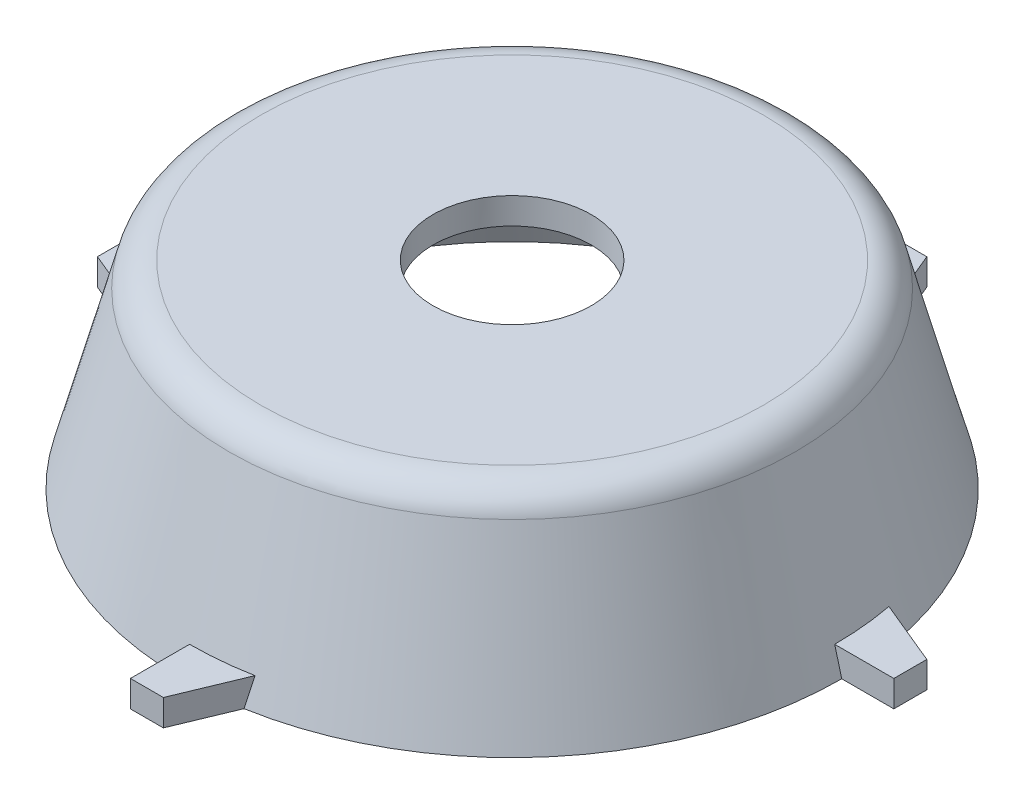
ISO-10303-21;
HEADER;
FILE_DESCRIPTION(('STEP AP214'),'2;1');
FILE_NAME('part.step','',(''),(''),'','','');
FILE_SCHEMA(('AUTOMOTIVE_DESIGN { 1 0 10303 214 1 1 1 1 }'));
ENDSEC;
DATA;
#1=APPLICATION_CONTEXT('core data for automotive mechanical design processes');
#2=APPLICATION_PROTOCOL_DEFINITION('international standard','automotive_design',2000,#1);
#3=PRODUCT_CONTEXT('',#1,'mechanical');
#4=PRODUCT('Part','Part','',(#3));
#5=PRODUCT_RELATED_PRODUCT_CATEGORY('part','',(#4));
#6=PRODUCT_DEFINITION_FORMATION('','',#4);
#7=PRODUCT_DEFINITION_CONTEXT('part definition',#1,'design');
#8=PRODUCT_DEFINITION('design','',#6,#7);
#9=PRODUCT_DEFINITION_SHAPE('','',#8);
#10=(LENGTH_UNIT() NAMED_UNIT(*) SI_UNIT(.MILLI.,.METRE.));
#11=(NAMED_UNIT(*) PLANE_ANGLE_UNIT() SI_UNIT($,.RADIAN.));
#12=(NAMED_UNIT(*) SI_UNIT($,.STERADIAN.) SOLID_ANGLE_UNIT());
#13=UNCERTAINTY_MEASURE_WITH_UNIT(LENGTH_MEASURE(1.E-05),#10,'distance_accuracy_value','');
#14=(GEOMETRIC_REPRESENTATION_CONTEXT(3) GLOBAL_UNCERTAINTY_ASSIGNED_CONTEXT((#13)) GLOBAL_UNIT_ASSIGNED_CONTEXT((#10,
#11,#12)) REPRESENTATION_CONTEXT('',''));
#15=CARTESIAN_POINT('',(0.,0.,0.));
#16=DIRECTION('',(0.,0.,1.));
#17=DIRECTION('',(1.,0.,0.));
#18=AXIS2_PLACEMENT_3D('',#15,#16,#17);
#19=CARTESIAN_POINT('',(1.02907469966574E-13,2.22044604925031E-13,0.));
#20=DIRECTION('',(0.,-1.,0.));
#21=DIRECTION('',(1.,0.,0.));
#22=AXIS2_PLACEMENT_3D('',#19,#20,#21);
#23=CONICAL_SURFACE('',#22,50.0000000000001,0.261799387799142);
#24=DIRECTION('',(0.25881904510251,0.965925826289071,0.));
#25=VECTOR('',#24,1.);
#26=CARTESIAN_POINT('',(-5.37185707356144E-13,186.60254037845,-1.06458725047994E-13));
#27=LINE('',#26,#25);
#28=CARTESIAN_POINT('',(-48.9282032302756,4.,0.));
#29=VERTEX_POINT('',#28);
#30=CARTESIAN_POINT('',(-50.,2.22044604925031E-13,0.));
#31=VERTEX_POINT('',#30);
#32=EDGE_CURVE('E318',#29,#31,#27,.F.);
#33=ORIENTED_EDGE('',*,*,#32,.F.);
#34=CARTESIAN_POINT('',(1.34157973235603E-13,4.,0.));
#35=DIRECTION('',(0.,1.,0.));
#36=DIRECTION('',(0.,0.,1.));
#37=AXIS2_PLACEMENT_3D('',#34,#35,#36);
#38=CIRCLE('',#37,48.9282032302757);
#39=CARTESIAN_POINT('',(-48.0786310836158,4.,9.07823245289093));
#40=VERTEX_POINT('',#39);
#41=EDGE_CURVE('E11',#40,#29,#38,.F.);
#42=ORIENTED_EDGE('',*,*,#41,.F.);
#43=CARTESIAN_POINT('',(-49.2568255225915,-0.000199999999606443,8.58897540010977));
#44=CARTESIAN_POINT('',(-49.0612545610458,0.666811191531647,8.67018820258965));
#45=CARTESIAN_POINT('',(-48.8652812794108,1.3336834524225,8.75156807252007));
#46=CARTESIAN_POINT('',(-48.4725300741455,2.6671501190916,8.91466194803643));
#47=CARTESIAN_POINT('',(-48.2757521505077,3.33374452486729,8.99637595362546));
#48=CARTESIAN_POINT('',(-48.0785719067731,4.0002,9.07825702666812));
#49=B_SPLINE_CURVE_WITH_KNOTS('',3,(#43,#44,#45,#46,#47,#48),.UNSPECIFIED.,.F.,.F.,(4,2,4),(0.,
2.0994574070967,4.19891483361632),.UNSPECIFIED.);
#50=CARTESIAN_POINT('',(-49.2567668776898,0.,8.58899975299313));
#51=VERTEX_POINT('',#50);
#52=EDGE_CURVE('E159',#51,#40,#49,.T.);
#53=ORIENTED_EDGE('',*,*,#52,.F.);
#54=CARTESIAN_POINT('',(1.02907469966574E-13,2.22044604925031E-13,0.));
#55=DIRECTION('',(0.,-1.,0.));
#56=DIRECTION('',(1.,0.,0.));
#57=AXIS2_PLACEMENT_3D('',#54,#55,#56);
#58=CIRCLE('',#57,50.0000000000001);
#59=CARTESIAN_POINT('',(-1.06458725047997E-13,2.22044604925031E-13,50.0000000000001));
#60=VERTEX_POINT('',#59);
#61=EDGE_CURVE('E349',#60,#51,#58,.T.);
#62=ORIENTED_EDGE('',*,*,#61,.F.);
#63=DIRECTION('',(0.,0.96592582628907,-0.258819045102514));
#64=VECTOR('',#63,1.);
#65=CARTESIAN_POINT('',(-1.06458725047996E-13,186.60254037845,0.));
#66=LINE('',#65,#64);
#67=CARTESIAN_POINT('',(-1.06458725047996E-13,4.,48.9282032302757));
#68=VERTEX_POINT('',#67);
#69=EDGE_CURVE('E347',#68,#60,#66,.F.);
#70=ORIENTED_EDGE('',*,*,#69,.F.);
#71=CARTESIAN_POINT('',(1.02907469966574E-13,4.,0.));
#72=DIRECTION('',(0.,1.,0.));
#73=DIRECTION('',(0.,0.,1.));
#74=AXIS2_PLACEMENT_3D('',#71,#72,#73);
#75=CIRCLE('',#74,48.9282032302757);
#76=CARTESIAN_POINT('',(9.07823245289071,4.,48.078631083616));
#77=VERTEX_POINT('',#76);
#78=EDGE_CURVE('E47',#77,#68,#75,.F.);
#79=ORIENTED_EDGE('',*,*,#78,.F.);
#80=CARTESIAN_POINT('',(8.58897540010952,-0.000199999999606653,49.2568255225917));
#81=CARTESIAN_POINT('',(8.6701882025894,0.666811191531646,49.061254561046));
#82=CARTESIAN_POINT('',(8.75156807251983,1.33368345242249,48.865281279411));
#83=CARTESIAN_POINT('',(8.91466194803619,2.6671501190916,48.4725300741457));
#84=CARTESIAN_POINT('',(8.99637595362522,3.33374452486729,48.2757521505079));
#85=CARTESIAN_POINT('',(9.07825702666788,4.0002,48.0785719067733));
#86=B_SPLINE_CURVE_WITH_KNOTS('',3,(#80,#81,#82,#83,#84,#85),.UNSPECIFIED.,.F.,.F.,(4,2,4),(0.,
2.0994574070967,4.19891483361633),.UNSPECIFIED.);
#87=CARTESIAN_POINT('',(8.5889997529929,0.,49.25676687769));
#88=VERTEX_POINT('',#87);
#89=EDGE_CURVE('E350',#88,#77,#86,.T.);
#90=ORIENTED_EDGE('',*,*,#89,.F.);
#91=CARTESIAN_POINT('',(50.0000000000002,2.22044604925031E-13,-4.17263475778476E-13));
#92=VERTEX_POINT('',#91);
#93=EDGE_CURVE('E330',#92,#88,#58,.T.);
#94=ORIENTED_EDGE('',*,*,#93,.F.);
#95=DIRECTION('',(-0.258819045102517,0.965925826289069,0.));
#96=VECTOR('',#95,1.);
#97=CARTESIAN_POINT('',(-5.37185707356143E-13,186.60254037845,1.06458725048001E-13));
#98=LINE('',#97,#96);
#99=CARTESIAN_POINT('',(48.9282032302758,4.,-4.06037000516901E-13));
#100=VERTEX_POINT('',#99);
#101=EDGE_CURVE('E229',#100,#92,#98,.F.);
#102=ORIENTED_EDGE('',*,*,#101,.F.);
#103=CARTESIAN_POINT('',(0.,4.,0.));
#104=DIRECTION('',(0.,1.,0.));
#105=DIRECTION('',(0.,0.,1.));
#106=AXIS2_PLACEMENT_3D('',#103,#104,#105);
#107=CIRCLE('',#106,48.9282032302757);
#108=CARTESIAN_POINT('',(48.078631083616,4.,-9.07823245289117));
#109=VERTEX_POINT('',#108);
#110=EDGE_CURVE('E336',#109,#100,#107,.F.);
#111=ORIENTED_EDGE('',*,*,#110,.F.);
#112=CARTESIAN_POINT('',(49.2568255225918,-0.000199999999606443,-8.58897540010998));
#113=CARTESIAN_POINT('',(49.0612545610461,0.666811191531648,-8.67018820258986));
#114=CARTESIAN_POINT('',(48.865281279411,1.3336834524225,-8.75156807252029));
#115=CARTESIAN_POINT('',(48.4725300741457,2.6671501190916,-8.91466194803665));
#116=CARTESIAN_POINT('',(48.2757521505079,3.33374452486729,-8.99637595362567));
#117=CARTESIAN_POINT('',(48.0785719067734,4.0002,-9.07825702666833));
#118=B_SPLINE_CURVE_WITH_KNOTS('',3,(#112,#113,#114,#115,#116,#117),.UNSPECIFIED.,.F.,.F.,(4,2,
4),(0.,2.09945740709671,4.19891483361633),.UNSPECIFIED.);
#119=CARTESIAN_POINT('',(49.25676687769,0.,-8.58899975299338));
#120=VERTEX_POINT('',#119);
#121=EDGE_CURVE('E183',#120,#109,#118,.T.);
#122=ORIENTED_EDGE('',*,*,#121,.F.);
#123=CARTESIAN_POINT('',(8.5889997529929,3.07017739330154E-13,-49.25676687769));
#124=VERTEX_POINT('',#123);
#125=EDGE_CURVE('E324',#124,#120,#58,.T.);
#126=ORIENTED_EDGE('',*,*,#125,.F.);
#127=CARTESIAN_POINT('',(8.58897540010952,-0.000199999999606653,-49.2568255225917));
#128=CARTESIAN_POINT('',(8.6701882025894,0.666811191531646,-49.061254561046));
#129=CARTESIAN_POINT('',(8.75156807251983,1.33368345242249,-48.865281279411));
#130=CARTESIAN_POINT('',(8.91466194803619,2.6671501190916,-48.4725300741457));
#131=CARTESIAN_POINT('',(8.99637595362522,3.33374452486729,-48.2757521505079));
#132=CARTESIAN_POINT('',(9.07825702666788,4.0002,-48.0785719067733));
#133=B_SPLINE_CURVE_WITH_KNOTS('',3,(#127,#128,#129,#130,#131,#132),.UNSPECIFIED.,.F.,.F.,(4,2,
4),(0.,2.0994574070967,4.19891483361633),.UNSPECIFIED.);
#134=CARTESIAN_POINT('',(9.07823245289071,4.,-48.078631083616));
#135=VERTEX_POINT('',#134);
#136=EDGE_CURVE('E255',#124,#135,#133,.T.);
#137=ORIENTED_EDGE('',*,*,#136,.T.);
#138=CARTESIAN_POINT('',(1.02907469966574E-13,4.,0.));
#139=DIRECTION('',(0.,1.,0.));
#140=DIRECTION('',(0.,0.,1.));
#141=AXIS2_PLACEMENT_3D('',#138,#139,#140);
#142=CIRCLE('',#141,48.9282032302757);
#143=CARTESIAN_POINT('',(-9.07823245289072,4.,-48.0786310836159));
#144=VERTEX_POINT('',#143);
#145=EDGE_CURVE('E327',#144,#135,#142,.F.);
#146=ORIENTED_EDGE('',*,*,#145,.F.);
#147=CARTESIAN_POINT('',(-8.58897540010955,-0.000199999999605253,-49.2568255225917));
#148=CARTESIAN_POINT('',(-8.67018820258943,0.666811191531649,-49.061254561046));
#149=CARTESIAN_POINT('',(-8.75156807251985,1.3336834524225,-48.865281279411));
#150=CARTESIAN_POINT('',(-8.91466194803621,2.6671501190916,-48.4725300741456));
#151=CARTESIAN_POINT('',(-8.99637595362524,3.33374452486729,-48.2757521505078));
#152=CARTESIAN_POINT('',(-9.0782570266679,4.0002,-48.0785719067733));
#153=B_SPLINE_CURVE_WITH_KNOTS('',3,(#147,#148,#149,#150,#151,#152),.UNSPECIFIED.,.F.,.F.,(4,2,
4),(0.,2.0994574070967,4.19891483361632),.UNSPECIFIED.);
#154=CARTESIAN_POINT('',(-8.58899975299292,0.,-49.25676687769));
#155=VERTEX_POINT('',#154);
#156=EDGE_CURVE('E276',#155,#144,#153,.T.);
#157=ORIENTED_EDGE('',*,*,#156,.F.);
#158=EDGE_CURVE('E332',#31,#155,#58,.T.);
#159=ORIENTED_EDGE('',*,*,#158,.F.);
#160=EDGE_LOOP('',(#33,#42,#53,#62,#70,#79,#90,#94,#102,#111,#122,#126,#137,#146,#157,#159));
#161=FACE_BOUND('',#160,.T.);
#162=CARTESIAN_POINT('',(1.07346538818351E-13,26.2940952255126,0.));
#163=DIRECTION('',(0.,-1.,0.));
#164=DIRECTION('',(1.,0.,0.));
#165=AXIS2_PLACEMENT_3D('',#162,#163,#164);
#166=CIRCLE('',#165,42.9545184186172);
#167=CARTESIAN_POINT('',(42.9545184186173,26.2940952255127,0.));
#168=VERTEX_POINT('',#167);
#169=EDGE_CURVE('E321',#168,#168,#166,.T.);
#170=ORIENTED_EDGE('',*,*,#169,.T.);
#171=EDGE_LOOP('',(#170));
#172=FACE_BOUND('',#171,.T.);
#173=ADVANCED_FACE('F39',(#161,#172),#23,.T.);
#174=CARTESIAN_POINT('',(0.,30.,0.));
#175=DIRECTION('',(0.,-1.,0.));
#176=DIRECTION('',(0.,0.,-1.));
#177=AXIS2_PLACEMENT_3D('',#174,#175,#176);
#178=PLANE('',#177);
#179=CARTESIAN_POINT('',(1.07346538818351E-13,30.,0.));
#180=DIRECTION('',(0.,-1.,0.));
#181=DIRECTION('',(0.,0.,-1.));
#182=AXIS2_PLACEMENT_3D('',#179,#180,#181);
#183=CIRCLE('',#182,38.1248892871719);
#184=CARTESIAN_POINT('',(1.07346538818351E-13,30.,-38.1248892871718));
#185=VERTEX_POINT('',#184);
#186=EDGE_CURVE('E323',#185,#185,#183,.F.);
#187=ORIENTED_EDGE('',*,*,#186,.T.);
#188=EDGE_LOOP('',(#187));
#189=FACE_BOUND('',#188,.T.);
#190=CARTESIAN_POINT('',(0.,30.,0.));
#191=DIRECTION('',(0.,1.,0.));
#192=DIRECTION('',(0.,0.,1.));
#193=AXIS2_PLACEMENT_3D('',#190,#191,#192);
#194=CIRCLE('',#193,12.);
#195=CARTESIAN_POINT('',(0.,30.,12.));
#196=VERTEX_POINT('',#195);
#197=EDGE_CURVE('E284',#196,#196,#194,.T.);
#198=ORIENTED_EDGE('',*,*,#197,.F.);
#199=EDGE_LOOP('',(#198));
#200=FACE_BOUND('',#199,.T.);
#201=ADVANCED_FACE('F309',(#189,#200),#178,.F.);
#202=CARTESIAN_POINT('',(0.,0.,0.));
#203=DIRECTION('',(0.,1.,0.));
#204=DIRECTION('',(0.,0.,1.));
#205=AXIS2_PLACEMENT_3D('',#202,#203,#204);
#206=PLANE('',#205);
#207=ORIENTED_EDGE('',*,*,#61,.T.);
#208=DIRECTION('',(-0.923537473297188,0.,-0.383508194717983));
#209=VECTOR('',#208,1.);
#210=CARTESIAN_POINT('',(-57.8995437705819,0.,5.0000000000002));
#211=LINE('',#210,#209);
#212=CARTESIAN_POINT('',(-57.8995437705819,0.,5.0000000000002));
#213=VERTEX_POINT('',#212);
#214=EDGE_CURVE('E179',#51,#213,#211,.T.);
#215=ORIENTED_EDGE('',*,*,#214,.T.);
#216=DIRECTION('',(0.,0.,-1.));
#217=VECTOR('',#216,1.);
#218=CARTESIAN_POINT('',(-57.8995437705819,0.,0.));
#219=LINE('',#218,#217);
#220=CARTESIAN_POINT('',(-57.8995437705819,0.,0.));
#221=VERTEX_POINT('',#220);
#222=EDGE_CURVE('E169',#213,#221,#219,.T.);
#223=ORIENTED_EDGE('',*,*,#222,.T.);
#224=DIRECTION('',(1.,0.,0.));
#225=VECTOR('',#224,1.);
#226=CARTESIAN_POINT('',(-45.8588952783598,0.,0.));
#227=LINE('',#226,#225);
#228=EDGE_CURVE('E54',#221,#31,#227,.T.);
#229=ORIENTED_EDGE('',*,*,#228,.T.);
#230=ORIENTED_EDGE('',*,*,#158,.T.);
#231=DIRECTION('',(0.383508194717986,0.,-0.923537473297186));
#232=VECTOR('',#231,1.);
#233=CARTESIAN_POINT('',(-5.,0.,-57.8995437705819));
#234=LINE('',#233,#232);
#235=CARTESIAN_POINT('',(-5.,0.,-57.8995437705819));
#236=VERTEX_POINT('',#235);
#237=EDGE_CURVE('E263',#155,#236,#234,.T.);
#238=ORIENTED_EDGE('',*,*,#237,.T.);
#239=DIRECTION('',(1.,0.,0.));
#240=VECTOR('',#239,1.);
#241=CARTESIAN_POINT('',(1.06458725047996E-13,0.,-57.8995437705819));
#242=LINE('',#241,#240);
#243=CARTESIAN_POINT('',(5.,0.,-57.8995437705819));
#244=VERTEX_POINT('',#243);
#245=EDGE_CURVE('E269',#236,#244,#242,.T.);
#246=ORIENTED_EDGE('',*,*,#245,.T.);
#247=DIRECTION('',(-0.383508194717986,0.,-0.923537473297186));
#248=VECTOR('',#247,1.);
#249=CARTESIAN_POINT('',(5.,0.,-57.8995437705819));
#250=LINE('',#249,#248);
#251=EDGE_CURVE('E405',#124,#244,#250,.T.);
#252=ORIENTED_EDGE('',*,*,#251,.F.);
#253=ORIENTED_EDGE('',*,*,#125,.T.);
#254=DIRECTION('',(0.92353747329719,0.,0.383508194717976));
#255=VECTOR('',#254,1.);
#256=CARTESIAN_POINT('',(57.8995437705818,0.,-5.00000000000061));
#257=LINE('',#256,#255);
#258=CARTESIAN_POINT('',(57.8995437705818,0.,-5.00000000000061));
#259=VERTEX_POINT('',#258);
#260=EDGE_CURVE('E215',#120,#259,#257,.T.);
#261=ORIENTED_EDGE('',*,*,#260,.T.);
#262=DIRECTION('',(0.,0.,1.));
#263=VECTOR('',#262,1.);
#264=CARTESIAN_POINT('',(57.8995437705819,0.,-5.00006804759558E-13));
#265=LINE('',#264,#263);
#266=CARTESIAN_POINT('',(57.8995437705819,0.,-5.00006804759558E-13));
#267=VERTEX_POINT('',#266);
#268=EDGE_CURVE('E207',#259,#267,#265,.T.);
#269=ORIENTED_EDGE('',*,*,#268,.T.);
#270=DIRECTION('',(-1.,0.,0.));
#271=VECTOR('',#270,1.);
#272=CARTESIAN_POINT('',(45.8588952783598,0.,-3.73887706205068E-13));
#273=LINE('',#272,#271);
#274=EDGE_CURVE('E213',#267,#92,#273,.T.);
#275=ORIENTED_EDGE('',*,*,#274,.T.);
#276=ORIENTED_EDGE('',*,*,#93,.T.);
#277=DIRECTION('',(-0.383508194717986,0.,0.923537473297186));
#278=VECTOR('',#277,1.);
#279=CARTESIAN_POINT('',(5.,0.,57.8995437705819));
#280=LINE('',#279,#278);
#281=CARTESIAN_POINT('',(5.,0.,57.8995437705819));
#282=VERTEX_POINT('',#281);
#283=EDGE_CURVE('E196',#88,#282,#280,.T.);
#284=ORIENTED_EDGE('',*,*,#283,.T.);
#285=DIRECTION('',(-1.,0.,0.));
#286=VECTOR('',#285,1.);
#287=CARTESIAN_POINT('',(-1.06458725047996E-13,0.,57.8995437705819));
#288=LINE('',#287,#286);
#289=CARTESIAN_POINT('',(-1.06458725047996E-13,0.,57.8995437705819));
#290=VERTEX_POINT('',#289);
#291=EDGE_CURVE('E189',#282,#290,#288,.T.);
#292=ORIENTED_EDGE('',*,*,#291,.T.);
#293=DIRECTION('',(0.,0.,-1.));
#294=VECTOR('',#293,1.);
#295=CARTESIAN_POINT('',(-1.06458725047996E-13,0.,45.8588952783598));
#296=LINE('',#295,#294);
#297=EDGE_CURVE('E61',#290,#60,#296,.T.);
#298=ORIENTED_EDGE('',*,*,#297,.T.);
#299=EDGE_LOOP('',(#207,#215,#223,#229,#230,#238,#246,#252,#253,#261,#269,#275,#276,#284,#292,#298));
#300=FACE_BOUND('',#299,.T.);
#301=CARTESIAN_POINT('',(1.06458725047996E-13,0.,0.));
#302=DIRECTION('',(0.,1.,0.));
#303=DIRECTION('',(0.,0.,1.));
#304=AXIS2_PLACEMENT_3D('',#301,#302,#303);
#305=CIRCLE('',#304,45.8588952783598);
#306=CARTESIAN_POINT('',(1.06458725047996E-13,0.,45.8588952783599));
#307=VERTEX_POINT('',#306);
#308=EDGE_CURVE('E417',#307,#307,#305,.F.);
#309=ORIENTED_EDGE('',*,*,#308,.F.);
#310=EDGE_LOOP('',(#309));
#311=FACE_BOUND('',#310,.T.);
#312=ADVANCED_FACE('F299',(#300,#311),#206,.F.);
#313=CARTESIAN_POINT('',(0.,26.,0.));
#314=DIRECTION('',(0.,-1.,0.));
#315=DIRECTION('',(0.,0.,-1.));
#316=AXIS2_PLACEMENT_3D('',#313,#314,#315);
#317=PLANE('',#316);
#318=CARTESIAN_POINT('',(0.,26.,0.));
#319=DIRECTION('',(0.,-1.,0.));
#320=DIRECTION('',(0.,0.,-1.));
#321=AXIS2_PLACEMENT_3D('',#318,#319,#320);
#322=CIRCLE('',#321,12.);
#323=CARTESIAN_POINT('',(0.,26.,-12.));
#324=VERTEX_POINT('',#323);
#325=EDGE_CURVE('E283',#324,#324,#322,.F.);
#326=ORIENTED_EDGE('',*,*,#325,.T.);
#327=EDGE_LOOP('',(#326));
#328=FACE_BOUND('',#327,.T.);
#329=CARTESIAN_POINT('',(1.06458725047996E-13,26.,0.));
#330=DIRECTION('',(0.,-1.,0.));
#331=DIRECTION('',(0.,0.,-1.));
#332=AXIS2_PLACEMENT_3D('',#329,#330,#331);
#333=CIRCLE('',#332,38.8922162751509);
#334=CARTESIAN_POINT('',(1.06458725047996E-13,26.,-38.8922162751508));
#335=VERTEX_POINT('',#334);
#336=EDGE_CURVE('E419',#335,#335,#333,.T.);
#337=ORIENTED_EDGE('',*,*,#336,.T.);
#338=EDGE_LOOP('',(#337));
#339=FACE_BOUND('',#338,.T.);
#340=ADVANCED_FACE('F297',(#328,#339),#317,.T.);
#341=CARTESIAN_POINT('',(1.06458725047996E-13,-1.03527618040983,0.));
#342=DIRECTION('',(0.,-1.,0.));
#343=DIRECTION('',(1.,0.,0.));
#344=AXIS2_PLACEMENT_3D('',#341,#342,#343);
#345=CONICAL_SURFACE('',#344,46.1362966948438,0.261799387799142);
#346=ORIENTED_EDGE('',*,*,#336,.F.);
#347=EDGE_LOOP('',(#346));
#348=FACE_BOUND('',#347,.T.);
#349=ORIENTED_EDGE('',*,*,#308,.T.);
#350=EDGE_LOOP('',(#349));
#351=FACE_BOUND('',#350,.T.);
#352=ADVANCED_FACE('F295',(#348,#351),#345,.F.);
#353=CARTESIAN_POINT('',(0.,-0.001000000000001,0.));
#354=DIRECTION('',(0.,1.,0.));
#355=DIRECTION('',(0.,0.,1.));
#356=AXIS2_PLACEMENT_3D('',#353,#354,#355);
#357=CYLINDRICAL_SURFACE('',#356,12.);
#358=ORIENTED_EDGE('',*,*,#325,.F.);
#359=EDGE_LOOP('',(#358));
#360=FACE_BOUND('',#359,.T.);
#361=ORIENTED_EDGE('',*,*,#197,.T.);
#362=EDGE_LOOP('',(#361));
#363=FACE_BOUND('',#362,.T.);
#364=ADVANCED_FACE('F292',(#360,#363),#357,.F.);
#365=CARTESIAN_POINT('',(1.07346538818351E-13,25.,0.));
#366=DIRECTION('',(0.,-1.,0.));
#367=DIRECTION('',(0.,0.,-1.));
#368=AXIS2_PLACEMENT_3D('',#365,#366,#367);
#369=TOROIDAL_SURFACE('',#368,38.1248892871719,5.);
#370=ORIENTED_EDGE('',*,*,#186,.F.);
#371=EDGE_LOOP('',(#370));
#372=FACE_BOUND('',#371,.T.);
#373=ORIENTED_EDGE('',*,*,#169,.F.);
#374=EDGE_LOOP('',(#373));
#375=FACE_BOUND('',#374,.T.);
#376=ADVANCED_FACE('F41',(#372,#375),#369,.T.);
#377=CARTESIAN_POINT('',(1.06458725047996E-13,4.,-57.8995437705819));
#378=DIRECTION('',(0.,0.,-1.));
#379=DIRECTION('',(-1.,0.,0.));
#380=AXIS2_PLACEMENT_3D('',#377,#378,#379);
#381=PLANE('',#380);
#382=ORIENTED_EDGE('',*,*,#245,.F.);
#383=DIRECTION('',(0.,-1.,0.));
#384=VECTOR('',#383,1.);
#385=CARTESIAN_POINT('',(-5.,4.,-57.8995437705819));
#386=LINE('',#385,#384);
#387=CARTESIAN_POINT('',(-5.,4.,-57.8995437705819));
#388=VERTEX_POINT('',#387);
#389=EDGE_CURVE('E271',#388,#236,#386,.T.);
#390=ORIENTED_EDGE('',*,*,#389,.F.);
#391=DIRECTION('',(1.,0.,0.));
#392=VECTOR('',#391,1.);
#393=CARTESIAN_POINT('',(1.06458725047996E-13,4.,-57.8995437705819));
#394=LINE('',#393,#392);
#395=CARTESIAN_POINT('',(5.,4.,-57.8995437705819));
#396=VERTEX_POINT('',#395);
#397=EDGE_CURVE('E268',#388,#396,#394,.T.);
#398=ORIENTED_EDGE('',*,*,#397,.T.);
#399=DIRECTION('',(0.,-1.,0.));
#400=VECTOR('',#399,1.);
#401=CARTESIAN_POINT('',(5.,4.,-57.8995437705819));
#402=LINE('',#401,#400);
#403=EDGE_CURVE('E264',#396,#244,#402,.T.);
#404=ORIENTED_EDGE('',*,*,#403,.T.);
#405=EDGE_LOOP('',(#382,#390,#398,#404));
#406=FACE_BOUND('',#405,.T.);
#407=ADVANCED_FACE('F290',(#406),#381,.T.);
#408=CARTESIAN_POINT('',(-5.,4.,-57.8995437705819));
#409=DIRECTION('',(-0.923537473297186,0.,-0.383508194717986));
#410=DIRECTION('',(-0.383508194717986,0.,0.923537473297186));
#411=AXIS2_PLACEMENT_3D('',#408,#409,#410);
#412=PLANE('',#411);
#413=ORIENTED_EDGE('',*,*,#237,.F.);
#414=ORIENTED_EDGE('',*,*,#156,.T.);
#415=DIRECTION('',(0.383508194717986,0.,-0.923537473297186));
#416=VECTOR('',#415,1.);
#417=CARTESIAN_POINT('',(-5.,4.,-57.8995437705819));
#418=LINE('',#417,#416);
#419=EDGE_CURVE('E266',#144,#388,#418,.T.);
#420=ORIENTED_EDGE('',*,*,#419,.T.);
#421=ORIENTED_EDGE('',*,*,#389,.T.);
#422=EDGE_LOOP('',(#413,#414,#420,#421));
#423=FACE_BOUND('',#422,.T.);
#424=ADVANCED_FACE('F286',(#423),#412,.T.);
#425=CARTESIAN_POINT('',(0.,4.,0.));
#426=DIRECTION('',(0.,1.,0.));
#427=DIRECTION('',(0.,0.,1.));
#428=AXIS2_PLACEMENT_3D('',#425,#426,#427);
#429=PLANE('',#428);
#430=ORIENTED_EDGE('',*,*,#419,.F.);
#431=ORIENTED_EDGE('',*,*,#145,.T.);
#432=DIRECTION('',(-0.383508194717986,0.,-0.923537473297186));
#433=VECTOR('',#432,1.);
#434=CARTESIAN_POINT('',(5.,4.,-57.8995437705819));
#435=LINE('',#434,#433);
#436=EDGE_CURVE('E412',#135,#396,#435,.T.);
#437=ORIENTED_EDGE('',*,*,#436,.T.);
#438=ORIENTED_EDGE('',*,*,#397,.F.);
#439=EDGE_LOOP('',(#430,#431,#437,#438));
#440=FACE_BOUND('',#439,.T.);
#441=ADVANCED_FACE('F251',(#440),#429,.T.);
#442=CARTESIAN_POINT('',(5.,4.,-57.8995437705819));
#443=DIRECTION('',(-0.923537473297186,0.,0.383508194717986));
#444=DIRECTION('',(0.383508194717986,0.,0.923537473297186));
#445=AXIS2_PLACEMENT_3D('',#442,#443,#444);
#446=PLANE('',#445);
#447=ORIENTED_EDGE('',*,*,#136,.F.);
#448=ORIENTED_EDGE('',*,*,#251,.T.);
#449=ORIENTED_EDGE('',*,*,#403,.F.);
#450=ORIENTED_EDGE('',*,*,#436,.F.);
#451=EDGE_LOOP('',(#447,#448,#449,#450));
#452=FACE_BOUND('',#451,.T.);
#453=ADVANCED_FACE('F246',(#452),#446,.F.);
#454=CARTESIAN_POINT('',(45.8588952783598,4.,-3.73887706205068E-13));
#455=DIRECTION('',(0.,0.,1.));
#456=DIRECTION('',(1.,0.,0.));
#457=AXIS2_PLACEMENT_3D('',#454,#455,#456);
#458=PLANE('',#457);
#459=DIRECTION('',(-1.,0.,0.));
#460=VECTOR('',#459,1.);
#461=CARTESIAN_POINT('',(45.8588952783598,4.,-3.73887706205068E-13));
#462=LINE('',#461,#460);
#463=CARTESIAN_POINT('',(57.8995437705819,4.,-5.00006804759558E-13));
#464=VERTEX_POINT('',#463);
#465=EDGE_CURVE('E203',#464,#100,#462,.T.);
#466=ORIENTED_EDGE('',*,*,#465,.T.);
#467=ORIENTED_EDGE('',*,*,#101,.T.);
#468=ORIENTED_EDGE('',*,*,#274,.F.);
#469=DIRECTION('',(0.,-1.,0.));
#470=VECTOR('',#469,1.);
#471=CARTESIAN_POINT('',(57.8995437705819,4.,-5.00006804759558E-13));
#472=LINE('',#471,#470);
#473=EDGE_CURVE('E197',#464,#267,#472,.T.);
#474=ORIENTED_EDGE('',*,*,#473,.F.);
#475=EDGE_LOOP('',(#466,#467,#468,#474));
#476=FACE_BOUND('',#475,.T.);
#477=ADVANCED_FACE('F243',(#476),#458,.T.);
#478=CARTESIAN_POINT('',(57.8995437705819,4.,-5.00006804759558E-13));
#479=DIRECTION('',(1.,0.,0.));
#480=DIRECTION('',(0.,0.,-1.));
#481=AXIS2_PLACEMENT_3D('',#478,#479,#480);
#482=PLANE('',#481);
#483=ORIENTED_EDGE('',*,*,#268,.F.);
#484=DIRECTION('',(0.,-1.,0.));
#485=VECTOR('',#484,1.);
#486=CARTESIAN_POINT('',(57.8995437705818,4.,-5.00000000000061));
#487=LINE('',#486,#485);
#488=CARTESIAN_POINT('',(57.8995437705818,4.,-5.00000000000061));
#489=VERTEX_POINT('',#488);
#490=EDGE_CURVE('E212',#489,#259,#487,.T.);
#491=ORIENTED_EDGE('',*,*,#490,.F.);
#492=DIRECTION('',(0.,0.,1.));
#493=VECTOR('',#492,1.);
#494=CARTESIAN_POINT('',(57.8995437705819,4.,-5.00006804759558E-13));
#495=LINE('',#494,#493);
#496=EDGE_CURVE('E209',#489,#464,#495,.T.);
#497=ORIENTED_EDGE('',*,*,#496,.T.);
#498=ORIENTED_EDGE('',*,*,#473,.T.);
#499=EDGE_LOOP('',(#483,#491,#497,#498));
#500=FACE_BOUND('',#499,.T.);
#501=ADVANCED_FACE('F240',(#500),#482,.T.);
#502=CARTESIAN_POINT('',(57.8995437705818,4.,-5.00000000000061));
#503=DIRECTION('',(0.383508194717976,0.,-0.92353747329719));
#504=DIRECTION('',(-0.92353747329719,0.,-0.383508194717976));
#505=AXIS2_PLACEMENT_3D('',#502,#503,#504);
#506=PLANE('',#505);
#507=ORIENTED_EDGE('',*,*,#260,.F.);
#508=ORIENTED_EDGE('',*,*,#121,.T.);
#509=DIRECTION('',(0.92353747329719,0.,0.383508194717976));
#510=VECTOR('',#509,1.);
#511=CARTESIAN_POINT('',(57.8995437705818,4.,-5.00000000000061));
#512=LINE('',#511,#510);
#513=EDGE_CURVE('E206',#109,#489,#512,.T.);
#514=ORIENTED_EDGE('',*,*,#513,.T.);
#515=ORIENTED_EDGE('',*,*,#490,.T.);
#516=EDGE_LOOP('',(#507,#508,#514,#515));
#517=FACE_BOUND('',#516,.T.);
#518=ADVANCED_FACE('F234',(#517),#506,.T.);
#519=CARTESIAN_POINT('',(0.,4.,0.));
#520=DIRECTION('',(0.,1.,0.));
#521=DIRECTION('',(-1.,0.,0.));
#522=AXIS2_PLACEMENT_3D('',#519,#520,#521);
#523=PLANE('',#522);
#524=ORIENTED_EDGE('',*,*,#513,.F.);
#525=ORIENTED_EDGE('',*,*,#110,.T.);
#526=ORIENTED_EDGE('',*,*,#465,.F.);
#527=ORIENTED_EDGE('',*,*,#496,.F.);
#528=EDGE_LOOP('',(#524,#525,#526,#527));
#529=FACE_BOUND('',#528,.T.);
#530=ADVANCED_FACE('F239',(#529),#523,.T.);
#531=CARTESIAN_POINT('',(-1.06458725047996E-13,4.,45.8588952783598));
#532=DIRECTION('',(-1.,0.,0.));
#533=DIRECTION('',(0.,0.,1.));
#534=AXIS2_PLACEMENT_3D('',#531,#532,#533);
#535=PLANE('',#534);
#536=DIRECTION('',(0.,0.,-1.));
#537=VECTOR('',#536,1.);
#538=CARTESIAN_POINT('',(-1.06458725047996E-13,4.,45.8588952783598));
#539=LINE('',#538,#537);
#540=CARTESIAN_POINT('',(-1.06458725047996E-13,4.,57.8995437705819));
#541=VERTEX_POINT('',#540);
#542=EDGE_CURVE('E185',#541,#68,#539,.T.);
#543=ORIENTED_EDGE('',*,*,#542,.T.);
#544=ORIENTED_EDGE('',*,*,#69,.T.);
#545=ORIENTED_EDGE('',*,*,#297,.F.);
#546=DIRECTION('',(0.,-1.,0.));
#547=VECTOR('',#546,1.);
#548=CARTESIAN_POINT('',(-1.06458725047996E-13,4.,57.8995437705819));
#549=LINE('',#548,#547);
#550=EDGE_CURVE('E180',#541,#290,#549,.T.);
#551=ORIENTED_EDGE('',*,*,#550,.F.);
#552=EDGE_LOOP('',(#543,#544,#545,#551));
#553=FACE_BOUND('',#552,.T.);
#554=ADVANCED_FACE('F346',(#553),#535,.T.);
#555=CARTESIAN_POINT('',(-1.06458725047996E-13,4.,57.8995437705819));
#556=DIRECTION('',(0.,0.,1.));
#557=DIRECTION('',(1.,0.,0.));
#558=AXIS2_PLACEMENT_3D('',#555,#556,#557);
#559=PLANE('',#558);
#560=ORIENTED_EDGE('',*,*,#291,.F.);
#561=DIRECTION('',(0.,-1.,0.));
#562=VECTOR('',#561,1.);
#563=CARTESIAN_POINT('',(5.,4.,57.8995437705819));
#564=LINE('',#563,#562);
#565=CARTESIAN_POINT('',(5.,4.,57.8995437705819));
#566=VERTEX_POINT('',#565);
#567=EDGE_CURVE('E194',#566,#282,#564,.T.);
#568=ORIENTED_EDGE('',*,*,#567,.F.);
#569=DIRECTION('',(-1.,0.,0.));
#570=VECTOR('',#569,1.);
#571=CARTESIAN_POINT('',(-1.06458725047996E-13,4.,57.8995437705819));
#572=LINE('',#571,#570);
#573=EDGE_CURVE('E191',#566,#541,#572,.T.);
#574=ORIENTED_EDGE('',*,*,#573,.T.);
#575=ORIENTED_EDGE('',*,*,#550,.T.);
#576=EDGE_LOOP('',(#560,#568,#574,#575));
#577=FACE_BOUND('',#576,.T.);
#578=ADVANCED_FACE('F377',(#577),#559,.T.);
#579=CARTESIAN_POINT('',(5.,4.,57.8995437705819));
#580=DIRECTION('',(0.923537473297186,0.,0.383508194717986));
#581=DIRECTION('',(0.383508194717986,0.,-0.923537473297186));
#582=AXIS2_PLACEMENT_3D('',#579,#580,#581);
#583=PLANE('',#582);
#584=ORIENTED_EDGE('',*,*,#283,.F.);
#585=ORIENTED_EDGE('',*,*,#89,.T.);
#586=DIRECTION('',(-0.383508194717986,0.,0.923537473297186));
#587=VECTOR('',#586,1.);
#588=CARTESIAN_POINT('',(5.,4.,57.8995437705819));
#589=LINE('',#588,#587);
#590=EDGE_CURVE('E188',#77,#566,#589,.T.);
#591=ORIENTED_EDGE('',*,*,#590,.T.);
#592=ORIENTED_EDGE('',*,*,#567,.T.);
#593=EDGE_LOOP('',(#584,#585,#591,#592));
#594=FACE_BOUND('',#593,.T.);
#595=ADVANCED_FACE('F376',(#594),#583,.T.);
#596=CARTESIAN_POINT('',(0.,4.,0.));
#597=DIRECTION('',(0.,1.,0.));
#598=DIRECTION('',(0.,0.,-1.));
#599=AXIS2_PLACEMENT_3D('',#596,#597,#598);
#600=PLANE('',#599);
#601=ORIENTED_EDGE('',*,*,#590,.F.);
#602=ORIENTED_EDGE('',*,*,#78,.T.);
#603=ORIENTED_EDGE('',*,*,#542,.F.);
#604=ORIENTED_EDGE('',*,*,#573,.F.);
#605=EDGE_LOOP('',(#601,#602,#603,#604));
#606=FACE_BOUND('',#605,.T.);
#607=ADVANCED_FACE('F341',(#606),#600,.T.);
#608=CARTESIAN_POINT('',(-45.8588952783598,4.,0.));
#609=DIRECTION('',(0.,0.,-1.));
#610=DIRECTION('',(-1.,0.,0.));
#611=AXIS2_PLACEMENT_3D('',#608,#609,#610);
#612=PLANE('',#611);
#613=DIRECTION('',(1.,0.,0.));
#614=VECTOR('',#613,1.);
#615=CARTESIAN_POINT('',(-45.8588952783598,4.,0.));
#616=LINE('',#615,#614);
#617=CARTESIAN_POINT('',(-57.8995437705819,4.,0.));
#618=VERTEX_POINT('',#617);
#619=EDGE_CURVE('E164',#618,#29,#616,.T.);
#620=ORIENTED_EDGE('',*,*,#619,.T.);
#621=ORIENTED_EDGE('',*,*,#32,.T.);
#622=ORIENTED_EDGE('',*,*,#228,.F.);
#623=DIRECTION('',(0.,-1.,0.));
#624=VECTOR('',#623,1.);
#625=CARTESIAN_POINT('',(-57.8995437705819,4.,0.));
#626=LINE('',#625,#624);
#627=EDGE_CURVE('E170',#618,#221,#626,.T.);
#628=ORIENTED_EDGE('',*,*,#627,.F.);
#629=EDGE_LOOP('',(#620,#621,#622,#628));
#630=FACE_BOUND('',#629,.T.);
#631=ADVANCED_FACE('F370',(#630),#612,.T.);
#632=CARTESIAN_POINT('',(-57.8995437705819,4.,0.));
#633=DIRECTION('',(-1.,0.,0.));
#634=DIRECTION('',(0.,0.,1.));
#635=AXIS2_PLACEMENT_3D('',#632,#633,#634);
#636=PLANE('',#635);
#637=ORIENTED_EDGE('',*,*,#222,.F.);
#638=DIRECTION('',(0.,-1.,0.));
#639=VECTOR('',#638,1.);
#640=CARTESIAN_POINT('',(-57.8995437705819,4.,5.0000000000002));
#641=LINE('',#640,#639);
#642=CARTESIAN_POINT('',(-57.8995437705819,4.,5.0000000000002));
#643=VERTEX_POINT('',#642);
#644=EDGE_CURVE('E156',#643,#213,#641,.T.);
#645=ORIENTED_EDGE('',*,*,#644,.F.);
#646=DIRECTION('',(0.,0.,-1.));
#647=VECTOR('',#646,1.);
#648=CARTESIAN_POINT('',(-57.8995437705819,4.,0.));
#649=LINE('',#648,#647);
#650=EDGE_CURVE('E163',#643,#618,#649,.T.);
#651=ORIENTED_EDGE('',*,*,#650,.T.);
#652=ORIENTED_EDGE('',*,*,#627,.T.);
#653=EDGE_LOOP('',(#637,#645,#651,#652));
#654=FACE_BOUND('',#653,.T.);
#655=ADVANCED_FACE('F168',(#654),#636,.T.);
#656=CARTESIAN_POINT('',(-57.8995437705819,4.,5.0000000000002));
#657=DIRECTION('',(-0.383508194717983,0.,0.923537473297188));
#658=DIRECTION('',(0.923537473297188,0.,0.383508194717983));
#659=AXIS2_PLACEMENT_3D('',#656,#657,#658);
#660=PLANE('',#659);
#661=ORIENTED_EDGE('',*,*,#214,.F.);
#662=ORIENTED_EDGE('',*,*,#52,.T.);
#663=DIRECTION('',(-0.923537473297188,0.,-0.383508194717983));
#664=VECTOR('',#663,1.);
#665=CARTESIAN_POINT('',(-57.8995437705819,4.,5.0000000000002));
#666=LINE('',#665,#664);
#667=EDGE_CURVE('E153',#40,#643,#666,.T.);
#668=ORIENTED_EDGE('',*,*,#667,.T.);
#669=ORIENTED_EDGE('',*,*,#644,.T.);
#670=EDGE_LOOP('',(#661,#662,#668,#669));
#671=FACE_BOUND('',#670,.T.);
#672=ADVANCED_FACE('F155',(#671),#660,.T.);
#673=CARTESIAN_POINT('',(0.,4.,0.));
#674=DIRECTION('',(0.,1.,0.));
#675=DIRECTION('',(1.,0.,0.));
#676=AXIS2_PLACEMENT_3D('',#673,#674,#675);
#677=PLANE('',#676);
#678=ORIENTED_EDGE('',*,*,#667,.F.);
#679=ORIENTED_EDGE('',*,*,#41,.T.);
#680=ORIENTED_EDGE('',*,*,#619,.F.);
#681=ORIENTED_EDGE('',*,*,#650,.F.);
#682=EDGE_LOOP('',(#678,#679,#680,#681));
#683=FACE_BOUND('',#682,.T.);
#684=ADVANCED_FACE('F173',(#683),#677,.T.);
#685=CLOSED_SHELL('',(#173,#201,#312,#340,#352,#364,#376,#407,#424,#441,#453,#477,#501,#518,
#530,#554,#578,#595,#607,#631,#655,#672,#684));
#686=MANIFOLD_SOLID_BREP('B2',#685);
#687=ADVANCED_BREP_SHAPE_REPRESENTATION('',(#18,#686),#14);
#688=SHAPE_DEFINITION_REPRESENTATION(#9,#687);
ENDSEC;
END-ISO-10303-21;
